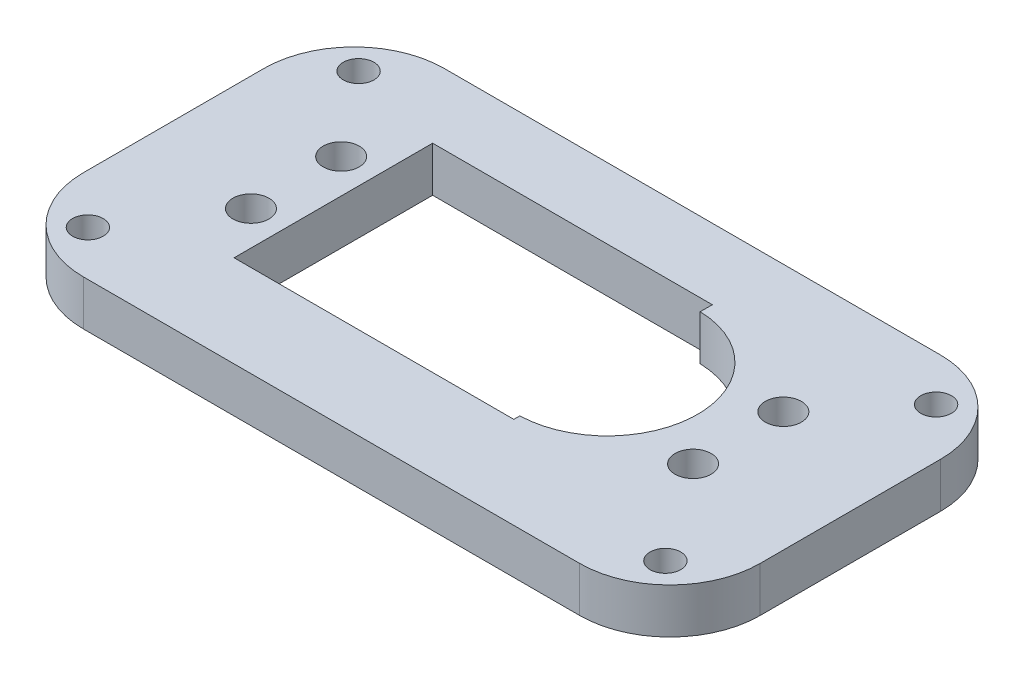
ISO-10303-21;
HEADER;
FILE_DESCRIPTION(('STEP AP214'),'2;1');
FILE_NAME('part.step','',(''),(''),'','','');
FILE_SCHEMA(('AUTOMOTIVE_DESIGN { 1 0 10303 214 1 1 1 1 }'));
ENDSEC;
DATA;
#1=APPLICATION_CONTEXT('core data for automotive mechanical design processes');
#2=APPLICATION_PROTOCOL_DEFINITION('international standard','automotive_design',2000,#1);
#3=PRODUCT_CONTEXT('',#1,'mechanical');
#4=PRODUCT('Part','Part','',(#3));
#5=PRODUCT_RELATED_PRODUCT_CATEGORY('part','',(#4));
#6=PRODUCT_DEFINITION_FORMATION('','',#4);
#7=PRODUCT_DEFINITION_CONTEXT('part definition',#1,'design');
#8=PRODUCT_DEFINITION('design','',#6,#7);
#9=PRODUCT_DEFINITION_SHAPE('','',#8);
#10=(LENGTH_UNIT() NAMED_UNIT(*) SI_UNIT(.MILLI.,.METRE.));
#11=(NAMED_UNIT(*) PLANE_ANGLE_UNIT() SI_UNIT($,.RADIAN.));
#12=(NAMED_UNIT(*) SI_UNIT($,.STERADIAN.) SOLID_ANGLE_UNIT());
#13=UNCERTAINTY_MEASURE_WITH_UNIT(LENGTH_MEASURE(1.E-05),#10,'distance_accuracy_value','');
#14=(GEOMETRIC_REPRESENTATION_CONTEXT(3) GLOBAL_UNCERTAINTY_ASSIGNED_CONTEXT((#13)) GLOBAL_UNIT_ASSIGNED_CONTEXT((#10,
#11,#12)) REPRESENTATION_CONTEXT('',''));
#15=CARTESIAN_POINT('',(0.,0.,0.));
#16=DIRECTION('',(0.,0.,1.));
#17=DIRECTION('',(1.,0.,0.));
#18=AXIS2_PLACEMENT_3D('',#15,#16,#17);
#19=CARTESIAN_POINT('',(37.5,5.,-20.));
#20=DIRECTION('',(-1.,0.,0.));
#21=DIRECTION('',(0.,0.,1.));
#22=AXIS2_PLACEMENT_3D('',#19,#20,#21);
#23=PLANE('',#22);
#24=DIRECTION('',(0.,0.,-1.));
#25=VECTOR('',#24,1.);
#26=CARTESIAN_POINT('',(37.5,5.,-20.));
#27=LINE('',#26,#25);
#28=CARTESIAN_POINT('',(37.5,5.,10.));
#29=VERTEX_POINT('',#28);
#30=CARTESIAN_POINT('',(37.5,5.,-10.));
#31=VERTEX_POINT('',#30);
#32=EDGE_CURVE('E195',#29,#31,#27,.T.);
#33=ORIENTED_EDGE('',*,*,#32,.F.);
#34=DIRECTION('',(0.,-1.,0.));
#35=VECTOR('',#34,1.);
#36=CARTESIAN_POINT('',(37.5,5.,10.));
#37=LINE('',#36,#35);
#38=CARTESIAN_POINT('',(37.5,0.,10.));
#39=VERTEX_POINT('',#38);
#40=EDGE_CURVE('E217',#29,#39,#37,.T.);
#41=ORIENTED_EDGE('',*,*,#40,.T.);
#42=DIRECTION('',(0.,0.,-1.));
#43=VECTOR('',#42,1.);
#44=CARTESIAN_POINT('',(37.5,0.,-20.));
#45=LINE('',#44,#43);
#46=CARTESIAN_POINT('',(37.5,0.,-10.));
#47=VERTEX_POINT('',#46);
#48=EDGE_CURVE('E187',#39,#47,#45,.T.);
#49=ORIENTED_EDGE('',*,*,#48,.T.);
#50=DIRECTION('',(0.,-1.,0.));
#51=VECTOR('',#50,1.);
#52=CARTESIAN_POINT('',(37.5,5.,-10.));
#53=LINE('',#52,#51);
#54=EDGE_CURVE('E206',#47,#31,#53,.F.);
#55=ORIENTED_EDGE('',*,*,#54,.T.);
#56=EDGE_LOOP('',(#33,#41,#49,#55));
#57=FACE_BOUND('',#56,.T.);
#58=ADVANCED_FACE('F33',(#57),#23,.F.);
#59=CARTESIAN_POINT('',(-37.5,5.,-20.));
#60=DIRECTION('',(0.,0.,1.));
#61=DIRECTION('',(1.,0.,0.));
#62=AXIS2_PLACEMENT_3D('',#59,#60,#61);
#63=PLANE('',#62);
#64=DIRECTION('',(-1.,0.,0.));
#65=VECTOR('',#64,1.);
#66=CARTESIAN_POINT('',(-37.5,0.,-20.));
#67=LINE('',#66,#65);
#68=CARTESIAN_POINT('',(27.5,0.,-20.));
#69=VERTEX_POINT('',#68);
#70=CARTESIAN_POINT('',(-27.5,0.,-20.));
#71=VERTEX_POINT('',#70);
#72=EDGE_CURVE('E209',#69,#71,#67,.T.);
#73=ORIENTED_EDGE('',*,*,#72,.T.);
#74=DIRECTION('',(0.,-1.,0.));
#75=VECTOR('',#74,1.);
#76=CARTESIAN_POINT('',(-27.5,5.,-20.));
#77=LINE('',#76,#75);
#78=CARTESIAN_POINT('',(-27.5,5.,-20.));
#79=VERTEX_POINT('',#78);
#80=EDGE_CURVE('E11',#71,#79,#77,.F.);
#81=ORIENTED_EDGE('',*,*,#80,.T.);
#82=DIRECTION('',(-1.,0.,0.));
#83=VECTOR('',#82,1.);
#84=CARTESIAN_POINT('',(-37.5,5.,-20.));
#85=LINE('',#84,#83);
#86=CARTESIAN_POINT('',(27.5,5.,-20.));
#87=VERTEX_POINT('',#86);
#88=EDGE_CURVE('E198',#87,#79,#85,.T.);
#89=ORIENTED_EDGE('',*,*,#88,.F.);
#90=DIRECTION('',(0.,-1.,0.));
#91=VECTOR('',#90,1.);
#92=CARTESIAN_POINT('',(27.5,5.,-20.));
#93=LINE('',#92,#91);
#94=EDGE_CURVE('E41',#87,#69,#93,.T.);
#95=ORIENTED_EDGE('',*,*,#94,.T.);
#96=EDGE_LOOP('',(#73,#81,#89,#95));
#97=FACE_BOUND('',#96,.T.);
#98=ADVANCED_FACE('F248',(#97),#63,.F.);
#99=CARTESIAN_POINT('',(-37.5,5.,-20.));
#100=DIRECTION('',(1.,0.,0.));
#101=DIRECTION('',(0.,0.,-1.));
#102=AXIS2_PLACEMENT_3D('',#99,#100,#101);
#103=PLANE('',#102);
#104=DIRECTION('',(0.,0.,1.));
#105=VECTOR('',#104,1.);
#106=CARTESIAN_POINT('',(-37.5,0.,-20.));
#107=LINE('',#106,#105);
#108=CARTESIAN_POINT('',(-37.5,0.,-10.));
#109=VERTEX_POINT('',#108);
#110=CARTESIAN_POINT('',(-37.5,0.,10.));
#111=VERTEX_POINT('',#110);
#112=EDGE_CURVE('E212',#109,#111,#107,.T.);
#113=ORIENTED_EDGE('',*,*,#112,.T.);
#114=DIRECTION('',(0.,-1.,0.));
#115=VECTOR('',#114,1.);
#116=CARTESIAN_POINT('',(-37.5,5.,10.));
#117=LINE('',#116,#115);
#118=CARTESIAN_POINT('',(-37.5,5.,10.));
#119=VERTEX_POINT('',#118);
#120=EDGE_CURVE('E48',#111,#119,#117,.F.);
#121=ORIENTED_EDGE('',*,*,#120,.T.);
#122=DIRECTION('',(0.,0.,1.));
#123=VECTOR('',#122,1.);
#124=CARTESIAN_POINT('',(-37.5,5.,-20.));
#125=LINE('',#124,#123);
#126=CARTESIAN_POINT('',(-37.5,5.,-10.));
#127=VERTEX_POINT('',#126);
#128=EDGE_CURVE('E201',#127,#119,#125,.T.);
#129=ORIENTED_EDGE('',*,*,#128,.F.);
#130=DIRECTION('',(0.,-1.,0.));
#131=VECTOR('',#130,1.);
#132=CARTESIAN_POINT('',(-37.5,5.,-10.));
#133=LINE('',#132,#131);
#134=EDGE_CURVE('E240',#127,#109,#133,.T.);
#135=ORIENTED_EDGE('',*,*,#134,.T.);
#136=EDGE_LOOP('',(#113,#121,#129,#135));
#137=FACE_BOUND('',#136,.T.);
#138=ADVANCED_FACE('F257',(#137),#103,.F.);
#139=CARTESIAN_POINT('',(-37.5,5.,20.));
#140=DIRECTION('',(0.,0.,-1.));
#141=DIRECTION('',(-1.,0.,0.));
#142=AXIS2_PLACEMENT_3D('',#139,#140,#141);
#143=PLANE('',#142);
#144=DIRECTION('',(1.,0.,0.));
#145=VECTOR('',#144,1.);
#146=CARTESIAN_POINT('',(-37.5,0.,20.));
#147=LINE('',#146,#145);
#148=CARTESIAN_POINT('',(-27.5,0.,20.));
#149=VERTEX_POINT('',#148);
#150=CARTESIAN_POINT('',(27.5,0.,20.));
#151=VERTEX_POINT('',#150);
#152=EDGE_CURVE('E199',#149,#151,#147,.T.);
#153=ORIENTED_EDGE('',*,*,#152,.T.);
#154=DIRECTION('',(0.,-1.,0.));
#155=VECTOR('',#154,1.);
#156=CARTESIAN_POINT('',(27.5,5.,20.));
#157=LINE('',#156,#155);
#158=CARTESIAN_POINT('',(27.5,5.,20.));
#159=VERTEX_POINT('',#158);
#160=EDGE_CURVE('E231',#151,#159,#157,.F.);
#161=ORIENTED_EDGE('',*,*,#160,.T.);
#162=DIRECTION('',(1.,0.,0.));
#163=VECTOR('',#162,1.);
#164=CARTESIAN_POINT('',(-37.5,5.,20.));
#165=LINE('',#164,#163);
#166=CARTESIAN_POINT('',(-27.5,5.,20.));
#167=VERTEX_POINT('',#166);
#168=EDGE_CURVE('E203',#167,#159,#165,.T.);
#169=ORIENTED_EDGE('',*,*,#168,.F.);
#170=DIRECTION('',(0.,-1.,0.));
#171=VECTOR('',#170,1.);
#172=CARTESIAN_POINT('',(-27.5,5.,20.));
#173=LINE('',#172,#171);
#174=EDGE_CURVE('E228',#167,#149,#173,.T.);
#175=ORIENTED_EDGE('',*,*,#174,.T.);
#176=EDGE_LOOP('',(#153,#161,#169,#175));
#177=FACE_BOUND('',#176,.T.);
#178=ADVANCED_FACE('F266',(#177),#143,.F.);
#179=CARTESIAN_POINT('',(0.,5.,0.));
#180=DIRECTION('',(0.,1.,0.));
#181=DIRECTION('',(0.,0.,1.));
#182=AXIS2_PLACEMENT_3D('',#179,#180,#181);
#183=PLANE('',#182);
#184=CARTESIAN_POINT('',(-32.,5.,15.));
#185=DIRECTION('',(0.,1.,0.));
#186=DIRECTION('',(0.,0.,1.));
#187=AXIS2_PLACEMENT_3D('',#184,#185,#186);
#188=CIRCLE('',#187,1.7);
#189=CARTESIAN_POINT('',(-32.,5.,16.7));
#190=VERTEX_POINT('',#189);
#191=EDGE_CURVE('E493',#190,#190,#188,.T.);
#192=ORIENTED_EDGE('',*,*,#191,.F.);
#193=EDGE_LOOP('',(#192));
#194=FACE_BOUND('',#193,.T.);
#195=CARTESIAN_POINT('',(32.,5.,15.));
#196=DIRECTION('',(0.,1.,0.));
#197=DIRECTION('',(0.,0.,1.));
#198=AXIS2_PLACEMENT_3D('',#195,#196,#197);
#199=CIRCLE('',#198,1.69999999999999);
#200=CARTESIAN_POINT('',(32.,5.,16.7));
#201=VERTEX_POINT('',#200);
#202=EDGE_CURVE('E497',#201,#201,#199,.T.);
#203=ORIENTED_EDGE('',*,*,#202,.F.);
#204=EDGE_LOOP('',(#203));
#205=FACE_BOUND('',#204,.T.);
#206=CARTESIAN_POINT('',(32.,5.,-15.));
#207=DIRECTION('',(0.,1.,0.));
#208=DIRECTION('',(0.,0.,1.));
#209=AXIS2_PLACEMENT_3D('',#206,#207,#208);
#210=CIRCLE('',#209,1.7);
#211=CARTESIAN_POINT('',(32.,5.,-13.3));
#212=VERTEX_POINT('',#211);
#213=EDGE_CURVE('E501',#212,#212,#210,.T.);
#214=ORIENTED_EDGE('',*,*,#213,.F.);
#215=EDGE_LOOP('',(#214));
#216=FACE_BOUND('',#215,.T.);
#217=CARTESIAN_POINT('',(-32.,5.,-15.));
#218=DIRECTION('',(0.,1.,0.));
#219=DIRECTION('',(0.,0.,1.));
#220=AXIS2_PLACEMENT_3D('',#217,#218,#219);
#221=CIRCLE('',#220,1.7);
#222=CARTESIAN_POINT('',(-32.,5.,-13.3));
#223=VERTEX_POINT('',#222);
#224=EDGE_CURVE('E505',#223,#223,#221,.T.);
#225=ORIENTED_EDGE('',*,*,#224,.F.);
#226=EDGE_LOOP('',(#225));
#227=FACE_BOUND('',#226,.T.);
#228=CARTESIAN_POINT('',(-24.7701057548485,5.,4.1608751884036));
#229=DIRECTION('',(0.,1.,0.));
#230=DIRECTION('',(0.,0.,1.));
#231=AXIS2_PLACEMENT_3D('',#228,#229,#230);
#232=CIRCLE('',#231,2.);
#233=CARTESIAN_POINT('',(-24.7701057548485,5.,6.1608751884036));
#234=VERTEX_POINT('',#233);
#235=EDGE_CURVE('E509',#234,#234,#232,.T.);
#236=ORIENTED_EDGE('',*,*,#235,.F.);
#237=EDGE_LOOP('',(#236));
#238=FACE_BOUND('',#237,.T.);
#239=CARTESIAN_POINT('',(-24.7701057548485,5.,-5.8391248115964));
#240=DIRECTION('',(0.,1.,0.));
#241=DIRECTION('',(0.,0.,1.));
#242=AXIS2_PLACEMENT_3D('',#239,#240,#241);
#243=CIRCLE('',#242,2.);
#244=CARTESIAN_POINT('',(-24.7701057548485,5.,-3.83912481159639));
#245=VERTEX_POINT('',#244);
#246=EDGE_CURVE('E513',#245,#245,#243,.T.);
#247=ORIENTED_EDGE('',*,*,#246,.F.);
#248=EDGE_LOOP('',(#247));
#249=FACE_BOUND('',#248,.T.);
#250=CARTESIAN_POINT('',(24.2298942451515,5.,4.1608751884036));
#251=DIRECTION('',(0.,1.,0.));
#252=DIRECTION('',(0.,0.,1.));
#253=AXIS2_PLACEMENT_3D('',#250,#251,#252);
#254=CIRCLE('',#253,2.);
#255=CARTESIAN_POINT('',(24.2298942451515,5.,6.1608751884036));
#256=VERTEX_POINT('',#255);
#257=EDGE_CURVE('E517',#256,#256,#254,.T.);
#258=ORIENTED_EDGE('',*,*,#257,.F.);
#259=EDGE_LOOP('',(#258));
#260=FACE_BOUND('',#259,.T.);
#261=CARTESIAN_POINT('',(24.2298942451515,5.,-5.8391248115964));
#262=DIRECTION('',(0.,1.,0.));
#263=DIRECTION('',(0.,0.,1.));
#264=AXIS2_PLACEMENT_3D('',#261,#262,#263);
#265=CIRCLE('',#264,2.00000000000001);
#266=CARTESIAN_POINT('',(24.2298942451515,5.,-3.83912481159638));
#267=VERTEX_POINT('',#266);
#268=EDGE_CURVE('E177',#267,#267,#265,.T.);
#269=ORIENTED_EDGE('',*,*,#268,.F.);
#270=EDGE_LOOP('',(#269));
#271=FACE_BOUND('',#270,.T.);
#272=DIRECTION('',(0.,0.,-1.));
#273=VECTOR('',#272,1.);
#274=CARTESIAN_POINT('',(10.0222132365965,5.,0.));
#275=LINE('',#274,#273);
#276=CARTESIAN_POINT('',(10.0222132365965,5.,9.821914183969));
#277=VERTEX_POINT('',#276);
#278=CARTESIAN_POINT('',(10.0222132365965,5.,9.15660175565426));
#279=VERTEX_POINT('',#278);
#280=EDGE_CURVE('E142',#277,#279,#275,.T.);
#281=ORIENTED_EDGE('',*,*,#280,.F.);
#282=DIRECTION('',(0.999999988550517,0.,0.000151324044555357));
#283=VECTOR('',#282,1.);
#284=CARTESIAN_POINT('',(-0.00148606226425178,5.,9.82039735723232));
#285=LINE('',#284,#283);
#286=CARTESIAN_POINT('',(-20.9811162000573,5.,9.81722263471025));
#287=VERTEX_POINT('',#286);
#288=EDGE_CURVE('E161',#287,#277,#285,.T.);
#289=ORIENTED_EDGE('',*,*,#288,.F.);
#290=DIRECTION('',(-0.000151324044555358,0.,0.999999988550517));
#291=VECTOR('',#290,1.);
#292=CARTESIAN_POINT('',(-20.9796301377931,5.,-0.00317472252207527));
#293=LINE('',#292,#291);
#294=CARTESIAN_POINT('',(-20.9777867634036,5.,-12.1848103230138));
#295=VERTEX_POINT('',#294);
#296=EDGE_CURVE('E164',#295,#287,#293,.T.);
#297=ORIENTED_EDGE('',*,*,#296,.F.);
#298=DIRECTION('',(-0.999999976472949,0.,-0.000216919574991404));
#299=VECTOR('',#298,1.);
#300=CARTESIAN_POINT('',(0.00264213672351571,5.,-12.1802592571866));
#301=LINE('',#300,#299);
#302=CARTESIAN_POINT('',(10.0222132365965,5.,-12.1780858160309));
#303=VERTEX_POINT('',#302);
#304=EDGE_CURVE('E180',#303,#295,#301,.T.);
#305=ORIENTED_EDGE('',*,*,#304,.F.);
#306=CARTESIAN_POINT('',(10.0222132365965,5.,-10.8348513788471));
#307=VERTEX_POINT('',#306);
#308=EDGE_CURVE('E178',#307,#303,#275,.T.);
#309=ORIENTED_EDGE('',*,*,#308,.F.);
#310=CARTESIAN_POINT('',(9.72989424515146,5.,-0.839124811596399));
#311=DIRECTION('',(0.,1.,0.));
#312=DIRECTION('',(0.,0.,1.));
#313=AXIS2_PLACEMENT_3D('',#310,#311,#312);
#314=CIRCLE('',#313,10.);
#315=EDGE_CURVE('E176',#279,#307,#314,.T.);
#316=ORIENTED_EDGE('',*,*,#315,.F.);
#317=EDGE_LOOP('',(#281,#289,#297,#305,#309,#316));
#318=FACE_BOUND('',#317,.T.);
#319=ORIENTED_EDGE('',*,*,#168,.T.);
#320=CARTESIAN_POINT('',(27.5,5.,10.));
#321=DIRECTION('',(0.,1.,0.));
#322=DIRECTION('',(0.,0.,1.));
#323=AXIS2_PLACEMENT_3D('',#320,#321,#322);
#324=CIRCLE('',#323,10.);
#325=EDGE_CURVE('E238',#159,#29,#324,.T.);
#326=ORIENTED_EDGE('',*,*,#325,.T.);
#327=ORIENTED_EDGE('',*,*,#32,.T.);
#328=CARTESIAN_POINT('',(27.5,5.,-10.));
#329=DIRECTION('',(0.,1.,0.));
#330=DIRECTION('',(0.,0.,1.));
#331=AXIS2_PLACEMENT_3D('',#328,#329,#330);
#332=CIRCLE('',#331,10.);
#333=EDGE_CURVE('E233',#31,#87,#332,.T.);
#334=ORIENTED_EDGE('',*,*,#333,.T.);
#335=ORIENTED_EDGE('',*,*,#88,.T.);
#336=CARTESIAN_POINT('',(-27.5,5.,-10.));
#337=DIRECTION('',(0.,1.,0.));
#338=DIRECTION('',(0.,0.,1.));
#339=AXIS2_PLACEMENT_3D('',#336,#337,#338);
#340=CIRCLE('',#339,10.);
#341=EDGE_CURVE('E55',#79,#127,#340,.T.);
#342=ORIENTED_EDGE('',*,*,#341,.T.);
#343=ORIENTED_EDGE('',*,*,#128,.T.);
#344=CARTESIAN_POINT('',(-27.5,5.,10.));
#345=DIRECTION('',(0.,1.,0.));
#346=DIRECTION('',(0.,0.,1.));
#347=AXIS2_PLACEMENT_3D('',#344,#345,#346);
#348=CIRCLE('',#347,10.);
#349=EDGE_CURVE('E236',#119,#167,#348,.T.);
#350=ORIENTED_EDGE('',*,*,#349,.T.);
#351=EDGE_LOOP('',(#319,#326,#327,#334,#335,#342,#343,#350));
#352=FACE_BOUND('',#351,.T.);
#353=ADVANCED_FACE('F259',(#194,#205,#216,#227,#238,#249,#260,#271,#318,#352),#183,.T.);
#354=CARTESIAN_POINT('',(0.,0.,0.));
#355=DIRECTION('',(0.,1.,0.));
#356=DIRECTION('',(0.,0.,1.));
#357=AXIS2_PLACEMENT_3D('',#354,#355,#356);
#358=PLANE('',#357);
#359=CARTESIAN_POINT('',(-32.,0.,15.));
#360=DIRECTION('',(0.,1.,0.));
#361=DIRECTION('',(0.,0.,1.));
#362=AXIS2_PLACEMENT_3D('',#359,#360,#361);
#363=CIRCLE('',#362,1.7);
#364=CARTESIAN_POINT('',(-32.,0.,16.7));
#365=VERTEX_POINT('',#364);
#366=EDGE_CURVE('E554',#365,#365,#363,.T.);
#367=ORIENTED_EDGE('',*,*,#366,.T.);
#368=EDGE_LOOP('',(#367));
#369=FACE_BOUND('',#368,.T.);
#370=CARTESIAN_POINT('',(32.,0.,15.));
#371=DIRECTION('',(0.,1.,0.));
#372=DIRECTION('',(0.,0.,1.));
#373=AXIS2_PLACEMENT_3D('',#370,#371,#372);
#374=CIRCLE('',#373,1.69999999999999);
#375=CARTESIAN_POINT('',(32.,0.,16.7));
#376=VERTEX_POINT('',#375);
#377=EDGE_CURVE('E558',#376,#376,#374,.T.);
#378=ORIENTED_EDGE('',*,*,#377,.T.);
#379=EDGE_LOOP('',(#378));
#380=FACE_BOUND('',#379,.T.);
#381=CARTESIAN_POINT('',(32.,0.,-15.));
#382=DIRECTION('',(0.,1.,0.));
#383=DIRECTION('',(0.,0.,1.));
#384=AXIS2_PLACEMENT_3D('',#381,#382,#383);
#385=CIRCLE('',#384,1.7);
#386=CARTESIAN_POINT('',(32.,0.,-13.3));
#387=VERTEX_POINT('',#386);
#388=EDGE_CURVE('E551',#387,#387,#385,.T.);
#389=ORIENTED_EDGE('',*,*,#388,.T.);
#390=EDGE_LOOP('',(#389));
#391=FACE_BOUND('',#390,.T.);
#392=CARTESIAN_POINT('',(-32.,0.,-15.));
#393=DIRECTION('',(0.,1.,0.));
#394=DIRECTION('',(0.,0.,1.));
#395=AXIS2_PLACEMENT_3D('',#392,#393,#394);
#396=CIRCLE('',#395,1.7);
#397=CARTESIAN_POINT('',(-32.,0.,-13.3));
#398=VERTEX_POINT('',#397);
#399=EDGE_CURVE('E545',#398,#398,#396,.T.);
#400=ORIENTED_EDGE('',*,*,#399,.T.);
#401=EDGE_LOOP('',(#400));
#402=FACE_BOUND('',#401,.T.);
#403=CARTESIAN_POINT('',(-24.7701057548485,0.,4.1608751884036));
#404=DIRECTION('',(0.,1.,0.));
#405=DIRECTION('',(0.,0.,1.));
#406=AXIS2_PLACEMENT_3D('',#403,#404,#405);
#407=CIRCLE('',#406,2.);
#408=CARTESIAN_POINT('',(-24.7701057548485,0.,6.1608751884036));
#409=VERTEX_POINT('',#408);
#410=EDGE_CURVE('E543',#409,#409,#407,.T.);
#411=ORIENTED_EDGE('',*,*,#410,.T.);
#412=EDGE_LOOP('',(#411));
#413=FACE_BOUND('',#412,.T.);
#414=CARTESIAN_POINT('',(-24.7701057548485,0.,-5.8391248115964));
#415=DIRECTION('',(0.,1.,0.));
#416=DIRECTION('',(0.,0.,1.));
#417=AXIS2_PLACEMENT_3D('',#414,#415,#416);
#418=CIRCLE('',#417,2.);
#419=CARTESIAN_POINT('',(-24.7701057548485,0.,-3.83912481159639));
#420=VERTEX_POINT('',#419);
#421=EDGE_CURVE('E540',#420,#420,#418,.T.);
#422=ORIENTED_EDGE('',*,*,#421,.T.);
#423=EDGE_LOOP('',(#422));
#424=FACE_BOUND('',#423,.T.);
#425=CARTESIAN_POINT('',(24.2298942451515,0.,4.1608751884036));
#426=DIRECTION('',(0.,1.,0.));
#427=DIRECTION('',(0.,0.,1.));
#428=AXIS2_PLACEMENT_3D('',#425,#426,#427);
#429=CIRCLE('',#428,2.);
#430=CARTESIAN_POINT('',(24.2298942451515,0.,6.1608751884036));
#431=VERTEX_POINT('',#430);
#432=EDGE_CURVE('E536',#431,#431,#429,.T.);
#433=ORIENTED_EDGE('',*,*,#432,.T.);
#434=EDGE_LOOP('',(#433));
#435=FACE_BOUND('',#434,.T.);
#436=CARTESIAN_POINT('',(24.2298942451515,0.,-5.8391248115964));
#437=DIRECTION('',(0.,1.,0.));
#438=DIRECTION('',(0.,0.,1.));
#439=AXIS2_PLACEMENT_3D('',#436,#437,#438);
#440=CIRCLE('',#439,2.00000000000001);
#441=CARTESIAN_POINT('',(24.2298942451515,0.,-3.83912481159638));
#442=VERTEX_POINT('',#441);
#443=EDGE_CURVE('E528',#442,#442,#440,.T.);
#444=ORIENTED_EDGE('',*,*,#443,.T.);
#445=EDGE_LOOP('',(#444));
#446=FACE_BOUND('',#445,.T.);
#447=DIRECTION('',(0.999999988550517,0.,0.000151324044555357));
#448=VECTOR('',#447,1.);
#449=CARTESIAN_POINT('',(-0.00148606226425178,0.,9.82039735723232));
#450=LINE('',#449,#448);
#451=CARTESIAN_POINT('',(-20.9811162000573,0.,9.81722263471025));
#452=VERTEX_POINT('',#451);
#453=CARTESIAN_POINT('',(10.0222132365965,0.,9.821914183969));
#454=VERTEX_POINT('',#453);
#455=EDGE_CURVE('E147',#452,#454,#450,.T.);
#456=ORIENTED_EDGE('',*,*,#455,.T.);
#457=DIRECTION('',(0.,0.,-1.));
#458=VECTOR('',#457,1.);
#459=CARTESIAN_POINT('',(10.0222132365965,0.,0.));
#460=LINE('',#459,#458);
#461=CARTESIAN_POINT('',(10.0222132365965,0.,9.15660175565426));
#462=VERTEX_POINT('',#461);
#463=EDGE_CURVE('E139',#454,#462,#460,.T.);
#464=ORIENTED_EDGE('',*,*,#463,.T.);
#465=CARTESIAN_POINT('',(9.72989424515146,0.,-0.839124811596399));
#466=DIRECTION('',(0.,1.,0.));
#467=DIRECTION('',(0.,0.,1.));
#468=AXIS2_PLACEMENT_3D('',#465,#466,#467);
#469=CIRCLE('',#468,10.);
#470=CARTESIAN_POINT('',(10.0222132365965,0.,-10.8348513788471));
#471=VERTEX_POINT('',#470);
#472=EDGE_CURVE('E151',#462,#471,#469,.T.);
#473=ORIENTED_EDGE('',*,*,#472,.T.);
#474=CARTESIAN_POINT('',(10.0222132365965,0.,-12.1780858160309));
#475=VERTEX_POINT('',#474);
#476=EDGE_CURVE('E155',#471,#475,#460,.T.);
#477=ORIENTED_EDGE('',*,*,#476,.T.);
#478=DIRECTION('',(-0.999999976472949,0.,-0.000216919574991404));
#479=VECTOR('',#478,1.);
#480=CARTESIAN_POINT('',(0.00264213672351571,0.,-12.1802592571866));
#481=LINE('',#480,#479);
#482=CARTESIAN_POINT('',(-20.9777867634036,0.,-12.1848103230138));
#483=VERTEX_POINT('',#482);
#484=EDGE_CURVE('E167',#475,#483,#481,.T.);
#485=ORIENTED_EDGE('',*,*,#484,.T.);
#486=DIRECTION('',(-0.000151324044555358,0.,0.999999988550517));
#487=VECTOR('',#486,1.);
#488=CARTESIAN_POINT('',(-20.9796301377931,0.,-0.00317472252207527));
#489=LINE('',#488,#487);
#490=EDGE_CURVE('E169',#483,#452,#489,.T.);
#491=ORIENTED_EDGE('',*,*,#490,.T.);
#492=EDGE_LOOP('',(#456,#464,#473,#477,#485,#491));
#493=FACE_BOUND('',#492,.T.);
#494=ORIENTED_EDGE('',*,*,#48,.F.);
#495=CARTESIAN_POINT('',(27.5,0.,10.));
#496=DIRECTION('',(0.,1.,0.));
#497=DIRECTION('',(0.,0.,1.));
#498=AXIS2_PLACEMENT_3D('',#495,#496,#497);
#499=CIRCLE('',#498,10.);
#500=EDGE_CURVE('E226',#39,#151,#499,.F.);
#501=ORIENTED_EDGE('',*,*,#500,.T.);
#502=ORIENTED_EDGE('',*,*,#152,.F.);
#503=CARTESIAN_POINT('',(-27.5,0.,10.));
#504=DIRECTION('',(0.,1.,0.));
#505=DIRECTION('',(0.,0.,1.));
#506=AXIS2_PLACEMENT_3D('',#503,#504,#505);
#507=CIRCLE('',#506,10.);
#508=EDGE_CURVE('E224',#149,#111,#507,.F.);
#509=ORIENTED_EDGE('',*,*,#508,.T.);
#510=ORIENTED_EDGE('',*,*,#112,.F.);
#511=CARTESIAN_POINT('',(-27.5,0.,-10.));
#512=DIRECTION('',(0.,1.,0.));
#513=DIRECTION('',(0.,0.,1.));
#514=AXIS2_PLACEMENT_3D('',#511,#512,#513);
#515=CIRCLE('',#514,10.);
#516=EDGE_CURVE('E222',#109,#71,#515,.F.);
#517=ORIENTED_EDGE('',*,*,#516,.T.);
#518=ORIENTED_EDGE('',*,*,#72,.F.);
#519=CARTESIAN_POINT('',(27.5,0.,-10.));
#520=DIRECTION('',(0.,1.,0.));
#521=DIRECTION('',(0.,0.,1.));
#522=AXIS2_PLACEMENT_3D('',#519,#520,#521);
#523=CIRCLE('',#522,10.);
#524=EDGE_CURVE('E220',#69,#47,#523,.F.);
#525=ORIENTED_EDGE('',*,*,#524,.T.);
#526=EDGE_LOOP('',(#494,#501,#502,#509,#510,#517,#518,#525));
#527=FACE_BOUND('',#526,.T.);
#528=ADVANCED_FACE('F157',(#369,#380,#391,#402,#413,#424,#435,#446,#493,#527),#358,.F.);
#529=CARTESIAN_POINT('',(10.0222132365965,0.,0.));
#530=DIRECTION('',(1.,0.,0.));
#531=DIRECTION('',(0.,0.,-1.));
#532=AXIS2_PLACEMENT_3D('',#529,#530,#531);
#533=PLANE('',#532);
#534=ORIENTED_EDGE('',*,*,#280,.T.);
#535=DIRECTION('',(0.,1.,0.));
#536=VECTOR('',#535,1.);
#537=CARTESIAN_POINT('',(10.0222132365965,0.,9.15660175565426));
#538=LINE('',#537,#536);
#539=EDGE_CURVE('E135',#462,#279,#538,.T.);
#540=ORIENTED_EDGE('',*,*,#539,.F.);
#541=ORIENTED_EDGE('',*,*,#463,.F.);
#542=DIRECTION('',(0.,1.,0.));
#543=VECTOR('',#542,1.);
#544=CARTESIAN_POINT('',(10.0222132365965,0.,9.821914183969));
#545=LINE('',#544,#543);
#546=EDGE_CURVE('E185',#454,#277,#545,.T.);
#547=ORIENTED_EDGE('',*,*,#546,.T.);
#548=EDGE_LOOP('',(#534,#540,#541,#547));
#549=FACE_BOUND('',#548,.T.);
#550=ADVANCED_FACE('F137',(#549),#533,.F.);
#551=CARTESIAN_POINT('',(-0.00148606226425178,0.,9.82039735723232));
#552=DIRECTION('',(-0.000151324044555357,0.,0.999999988550517));
#553=DIRECTION('',(0.999999988550517,0.,0.000151324044555357));
#554=AXIS2_PLACEMENT_3D('',#551,#552,#553);
#555=PLANE('',#554);
#556=ORIENTED_EDGE('',*,*,#288,.T.);
#557=ORIENTED_EDGE('',*,*,#546,.F.);
#558=ORIENTED_EDGE('',*,*,#455,.F.);
#559=DIRECTION('',(0.,1.,0.));
#560=VECTOR('',#559,1.);
#561=CARTESIAN_POINT('',(-20.9811162000573,0.,9.81722263471025));
#562=LINE('',#561,#560);
#563=EDGE_CURVE('E188',#452,#287,#562,.T.);
#564=ORIENTED_EDGE('',*,*,#563,.T.);
#565=EDGE_LOOP('',(#556,#557,#558,#564));
#566=FACE_BOUND('',#565,.T.);
#567=ADVANCED_FACE('F417',(#566),#555,.F.);
#568=CARTESIAN_POINT('',(-20.9796301377931,0.,-0.00317472252207527));
#569=DIRECTION('',(-0.999999988550517,0.,-0.000151324044555358));
#570=DIRECTION('',(-0.000151324044555358,0.,0.999999988550517));
#571=AXIS2_PLACEMENT_3D('',#568,#569,#570);
#572=PLANE('',#571);
#573=ORIENTED_EDGE('',*,*,#296,.T.);
#574=ORIENTED_EDGE('',*,*,#563,.F.);
#575=ORIENTED_EDGE('',*,*,#490,.F.);
#576=DIRECTION('',(0.,1.,0.));
#577=VECTOR('',#576,1.);
#578=CARTESIAN_POINT('',(-20.9777867634036,0.,-12.1848103230138));
#579=LINE('',#578,#577);
#580=EDGE_CURVE('E190',#483,#295,#579,.T.);
#581=ORIENTED_EDGE('',*,*,#580,.T.);
#582=EDGE_LOOP('',(#573,#574,#575,#581));
#583=FACE_BOUND('',#582,.T.);
#584=ADVANCED_FACE('F408',(#583),#572,.F.);
#585=CARTESIAN_POINT('',(0.00264213672351571,0.,-12.1802592571866));
#586=DIRECTION('',(0.000216919574991404,0.,-0.999999976472949));
#587=DIRECTION('',(-0.999999976472949,0.,-0.000216919574991404));
#588=AXIS2_PLACEMENT_3D('',#585,#586,#587);
#589=PLANE('',#588);
#590=ORIENTED_EDGE('',*,*,#304,.T.);
#591=ORIENTED_EDGE('',*,*,#580,.F.);
#592=ORIENTED_EDGE('',*,*,#484,.F.);
#593=DIRECTION('',(0.,1.,0.));
#594=VECTOR('',#593,1.);
#595=CARTESIAN_POINT('',(10.0222132365965,0.,-12.1780858160309));
#596=LINE('',#595,#594);
#597=EDGE_CURVE('E192',#475,#303,#596,.T.);
#598=ORIENTED_EDGE('',*,*,#597,.T.);
#599=EDGE_LOOP('',(#590,#591,#592,#598));
#600=FACE_BOUND('',#599,.T.);
#601=ADVANCED_FACE('F399',(#600),#589,.F.);
#602=ORIENTED_EDGE('',*,*,#308,.T.);
#603=ORIENTED_EDGE('',*,*,#597,.F.);
#604=ORIENTED_EDGE('',*,*,#476,.F.);
#605=DIRECTION('',(0.,1.,0.));
#606=VECTOR('',#605,1.);
#607=CARTESIAN_POINT('',(10.0222132365965,0.,-10.8348513788471));
#608=LINE('',#607,#606);
#609=EDGE_CURVE('E146',#471,#307,#608,.T.);
#610=ORIENTED_EDGE('',*,*,#609,.T.);
#611=EDGE_LOOP('',(#602,#603,#604,#610));
#612=FACE_BOUND('',#611,.T.);
#613=ADVANCED_FACE('F391',(#612),#533,.F.);
#614=CARTESIAN_POINT('',(9.72989424515146,0.,-0.839124811596399));
#615=DIRECTION('',(0.,1.,0.));
#616=DIRECTION('',(0.,0.,1.));
#617=AXIS2_PLACEMENT_3D('',#614,#615,#616);
#618=CYLINDRICAL_SURFACE('',#617,10.);
#619=ORIENTED_EDGE('',*,*,#315,.T.);
#620=ORIENTED_EDGE('',*,*,#609,.F.);
#621=ORIENTED_EDGE('',*,*,#472,.F.);
#622=ORIENTED_EDGE('',*,*,#539,.T.);
#623=EDGE_LOOP('',(#619,#620,#621,#622));
#624=FACE_BOUND('',#623,.T.);
#625=ADVANCED_FACE('F152',(#624),#618,.F.);
#626=CARTESIAN_POINT('',(24.2298942451515,0.,-5.8391248115964));
#627=DIRECTION('',(0.,1.,0.));
#628=DIRECTION('',(0.,0.,1.));
#629=AXIS2_PLACEMENT_3D('',#626,#627,#628);
#630=CYLINDRICAL_SURFACE('',#629,2.00000000000001);
#631=ORIENTED_EDGE('',*,*,#443,.F.);
#632=EDGE_LOOP('',(#631));
#633=FACE_BOUND('',#632,.T.);
#634=ORIENTED_EDGE('',*,*,#268,.T.);
#635=EDGE_LOOP('',(#634));
#636=FACE_BOUND('',#635,.T.);
#637=ADVANCED_FACE('F374',(#633,#636),#630,.F.);
#638=CARTESIAN_POINT('',(24.2298942451515,0.,4.1608751884036));
#639=DIRECTION('',(0.,1.,0.));
#640=DIRECTION('',(0.,0.,1.));
#641=AXIS2_PLACEMENT_3D('',#638,#639,#640);
#642=CYLINDRICAL_SURFACE('',#641,2.);
#643=ORIENTED_EDGE('',*,*,#432,.F.);
#644=EDGE_LOOP('',(#643));
#645=FACE_BOUND('',#644,.T.);
#646=ORIENTED_EDGE('',*,*,#257,.T.);
#647=EDGE_LOOP('',(#646));
#648=FACE_BOUND('',#647,.T.);
#649=ADVANCED_FACE('F365',(#645,#648),#642,.F.);
#650=CARTESIAN_POINT('',(-24.7701057548485,0.,-5.8391248115964));
#651=DIRECTION('',(0.,1.,0.));
#652=DIRECTION('',(0.,0.,1.));
#653=AXIS2_PLACEMENT_3D('',#650,#651,#652);
#654=CYLINDRICAL_SURFACE('',#653,2.);
#655=ORIENTED_EDGE('',*,*,#421,.F.);
#656=EDGE_LOOP('',(#655));
#657=FACE_BOUND('',#656,.T.);
#658=ORIENTED_EDGE('',*,*,#246,.T.);
#659=EDGE_LOOP('',(#658));
#660=FACE_BOUND('',#659,.T.);
#661=ADVANCED_FACE('F356',(#657,#660),#654,.F.);
#662=CARTESIAN_POINT('',(-24.7701057548485,0.,4.1608751884036));
#663=DIRECTION('',(0.,1.,0.));
#664=DIRECTION('',(0.,0.,1.));
#665=AXIS2_PLACEMENT_3D('',#662,#663,#664);
#666=CYLINDRICAL_SURFACE('',#665,2.);
#667=ORIENTED_EDGE('',*,*,#410,.F.);
#668=EDGE_LOOP('',(#667));
#669=FACE_BOUND('',#668,.T.);
#670=ORIENTED_EDGE('',*,*,#235,.T.);
#671=EDGE_LOOP('',(#670));
#672=FACE_BOUND('',#671,.T.);
#673=ADVANCED_FACE('F347',(#669,#672),#666,.F.);
#674=CARTESIAN_POINT('',(-32.,0.,-15.));
#675=DIRECTION('',(0.,1.,0.));
#676=DIRECTION('',(0.,0.,1.));
#677=AXIS2_PLACEMENT_3D('',#674,#675,#676);
#678=CYLINDRICAL_SURFACE('',#677,1.7);
#679=ORIENTED_EDGE('',*,*,#399,.F.);
#680=EDGE_LOOP('',(#679));
#681=FACE_BOUND('',#680,.T.);
#682=ORIENTED_EDGE('',*,*,#224,.T.);
#683=EDGE_LOOP('',(#682));
#684=FACE_BOUND('',#683,.T.);
#685=ADVANCED_FACE('F338',(#681,#684),#678,.F.);
#686=CARTESIAN_POINT('',(32.,0.,-15.));
#687=DIRECTION('',(0.,1.,0.));
#688=DIRECTION('',(0.,0.,1.));
#689=AXIS2_PLACEMENT_3D('',#686,#687,#688);
#690=CYLINDRICAL_SURFACE('',#689,1.7);
#691=ORIENTED_EDGE('',*,*,#388,.F.);
#692=EDGE_LOOP('',(#691));
#693=FACE_BOUND('',#692,.T.);
#694=ORIENTED_EDGE('',*,*,#213,.T.);
#695=EDGE_LOOP('',(#694));
#696=FACE_BOUND('',#695,.T.);
#697=ADVANCED_FACE('F329',(#693,#696),#690,.F.);
#698=CARTESIAN_POINT('',(32.,0.,15.));
#699=DIRECTION('',(0.,1.,0.));
#700=DIRECTION('',(0.,0.,1.));
#701=AXIS2_PLACEMENT_3D('',#698,#699,#700);
#702=CYLINDRICAL_SURFACE('',#701,1.69999999999999);
#703=ORIENTED_EDGE('',*,*,#377,.F.);
#704=EDGE_LOOP('',(#703));
#705=FACE_BOUND('',#704,.T.);
#706=ORIENTED_EDGE('',*,*,#202,.T.);
#707=EDGE_LOOP('',(#706));
#708=FACE_BOUND('',#707,.T.);
#709=ADVANCED_FACE('F320',(#705,#708),#702,.F.);
#710=CARTESIAN_POINT('',(-32.,0.,15.));
#711=DIRECTION('',(0.,1.,0.));
#712=DIRECTION('',(0.,0.,1.));
#713=AXIS2_PLACEMENT_3D('',#710,#711,#712);
#714=CYLINDRICAL_SURFACE('',#713,1.7);
#715=ORIENTED_EDGE('',*,*,#366,.F.);
#716=EDGE_LOOP('',(#715));
#717=FACE_BOUND('',#716,.T.);
#718=ORIENTED_EDGE('',*,*,#191,.T.);
#719=EDGE_LOOP('',(#718));
#720=FACE_BOUND('',#719,.T.);
#721=ADVANCED_FACE('F289',(#717,#720),#714,.F.);
#722=CARTESIAN_POINT('',(27.5,5.,10.));
#723=DIRECTION('',(0.,-1.,0.));
#724=DIRECTION('',(0.,0.,-1.));
#725=AXIS2_PLACEMENT_3D('',#722,#723,#724);
#726=CYLINDRICAL_SURFACE('',#725,10.);
#727=ORIENTED_EDGE('',*,*,#325,.F.);
#728=ORIENTED_EDGE('',*,*,#160,.F.);
#729=ORIENTED_EDGE('',*,*,#500,.F.);
#730=ORIENTED_EDGE('',*,*,#40,.F.);
#731=EDGE_LOOP('',(#727,#728,#729,#730));
#732=FACE_BOUND('',#731,.T.);
#733=ADVANCED_FACE('F271',(#732),#726,.T.);
#734=CARTESIAN_POINT('',(-27.5,5.,10.));
#735=DIRECTION('',(0.,-1.,0.));
#736=DIRECTION('',(0.,0.,-1.));
#737=AXIS2_PLACEMENT_3D('',#734,#735,#736);
#738=CYLINDRICAL_SURFACE('',#737,10.);
#739=ORIENTED_EDGE('',*,*,#349,.F.);
#740=ORIENTED_EDGE('',*,*,#120,.F.);
#741=ORIENTED_EDGE('',*,*,#508,.F.);
#742=ORIENTED_EDGE('',*,*,#174,.F.);
#743=EDGE_LOOP('',(#739,#740,#741,#742));
#744=FACE_BOUND('',#743,.T.);
#745=ADVANCED_FACE('F263',(#744),#738,.T.);
#746=CARTESIAN_POINT('',(-27.5,5.,-10.));
#747=DIRECTION('',(0.,-1.,0.));
#748=DIRECTION('',(0.,0.,-1.));
#749=AXIS2_PLACEMENT_3D('',#746,#747,#748);
#750=CYLINDRICAL_SURFACE('',#749,10.);
#751=ORIENTED_EDGE('',*,*,#341,.F.);
#752=ORIENTED_EDGE('',*,*,#80,.F.);
#753=ORIENTED_EDGE('',*,*,#516,.F.);
#754=ORIENTED_EDGE('',*,*,#134,.F.);
#755=EDGE_LOOP('',(#751,#752,#753,#754));
#756=FACE_BOUND('',#755,.T.);
#757=ADVANCED_FACE('F256',(#756),#750,.T.);
#758=CARTESIAN_POINT('',(27.5,5.,-10.));
#759=DIRECTION('',(0.,-1.,0.));
#760=DIRECTION('',(0.,0.,-1.));
#761=AXIS2_PLACEMENT_3D('',#758,#759,#760);
#762=CYLINDRICAL_SURFACE('',#761,10.);
#763=ORIENTED_EDGE('',*,*,#333,.F.);
#764=ORIENTED_EDGE('',*,*,#54,.F.);
#765=ORIENTED_EDGE('',*,*,#524,.F.);
#766=ORIENTED_EDGE('',*,*,#94,.F.);
#767=EDGE_LOOP('',(#763,#764,#765,#766));
#768=FACE_BOUND('',#767,.T.);
#769=ADVANCED_FACE('F35',(#768),#762,.T.);
#770=CLOSED_SHELL('',(#58,#98,#138,#178,#353,#528,#550,#567,#584,#601,#613,#625,#637,#649,#661,
#673,#685,#697,#709,#721,#733,#745,#757,#769));
#771=MANIFOLD_SOLID_BREP('B2',#770);
#772=ADVANCED_BREP_SHAPE_REPRESENTATION('',(#18,#771),#14);
#773=SHAPE_DEFINITION_REPRESENTATION(#9,#772);
ENDSEC;
END-ISO-10303-21;
